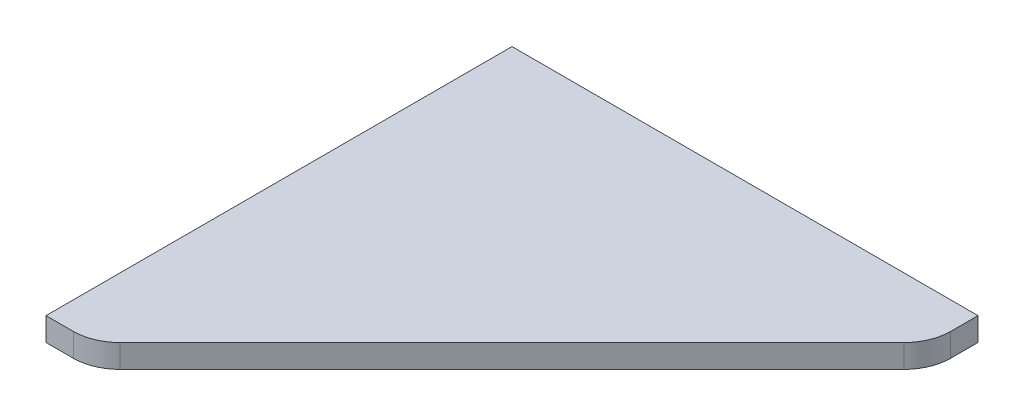
ISO-10303-21;
HEADER;
FILE_DESCRIPTION(('STEP AP214'),'2;1');
FILE_NAME('part.step','',(''),(''),'','','');
FILE_SCHEMA(('AUTOMOTIVE_DESIGN { 1 0 10303 214 1 1 1 1 }'));
ENDSEC;
DATA;
#1=APPLICATION_CONTEXT('core data for automotive mechanical design processes');
#2=APPLICATION_PROTOCOL_DEFINITION('international standard','automotive_design',2000,#1);
#3=PRODUCT_CONTEXT('',#1,'mechanical');
#4=PRODUCT('Part','Part','',(#3));
#5=PRODUCT_RELATED_PRODUCT_CATEGORY('part','',(#4));
#6=PRODUCT_DEFINITION_FORMATION('','',#4);
#7=PRODUCT_DEFINITION_CONTEXT('part definition',#1,'design');
#8=PRODUCT_DEFINITION('design','',#6,#7);
#9=PRODUCT_DEFINITION_SHAPE('','',#8);
#10=(LENGTH_UNIT() NAMED_UNIT(*) SI_UNIT(.MILLI.,.METRE.));
#11=(NAMED_UNIT(*) PLANE_ANGLE_UNIT() SI_UNIT($,.RADIAN.));
#12=(NAMED_UNIT(*) SI_UNIT($,.STERADIAN.) SOLID_ANGLE_UNIT());
#13=UNCERTAINTY_MEASURE_WITH_UNIT(LENGTH_MEASURE(1.E-05),#10,'distance_accuracy_value','');
#14=(GEOMETRIC_REPRESENTATION_CONTEXT(3) GLOBAL_UNCERTAINTY_ASSIGNED_CONTEXT((#13)) GLOBAL_UNIT_ASSIGNED_CONTEXT((#10,
#11,#12)) REPRESENTATION_CONTEXT('',''));
#15=CARTESIAN_POINT('',(0.,0.,0.));
#16=DIRECTION('',(0.,0.,1.));
#17=DIRECTION('',(1.,0.,0.));
#18=AXIS2_PLACEMENT_3D('',#15,#16,#17);
#19=CARTESIAN_POINT('',(0.,0.,0.));
#20=DIRECTION('',(0.,-1.,0.));
#21=DIRECTION('',(0.,0.,-1.));
#22=AXIS2_PLACEMENT_3D('',#19,#20,#21);
#23=PLANE('',#22);
#24=DIRECTION('',(-0.707106781186547,0.,0.707106781186548));
#25=VECTOR('',#24,1.);
#26=CARTESIAN_POINT('',(-32.2915814928118,0.,-32.2915814928118));
#27=LINE('',#26,#25);
#28=CARTESIAN_POINT('',(-134.823381605349,0.,70.2402186197255));
#29=VERTEX_POINT('',#28);
#30=CARTESIAN_POINT('',(-188.253637726418,0.,123.670474740795));
#31=VERTEX_POINT('',#30);
#32=EDGE_CURVE('E190',#29,#31,#27,.T.);
#33=ORIENTED_EDGE('',*,*,#32,.T.);
#34=CARTESIAN_POINT('',(-192.743765786953,0.,119.18034668026));
#35=DIRECTION('',(0.,1.,0.));
#36=DIRECTION('',(0.,0.,1.));
#37=AXIS2_PLACEMENT_3D('',#34,#35,#36);
#38=CIRCLE('',#37,6.34999999999999);
#39=CARTESIAN_POINT('',(-192.743765786953,0.,125.53034668026));
#40=VERTEX_POINT('',#39);
#41=EDGE_CURVE('E113',#40,#31,#38,.T.);
#42=ORIENTED_EDGE('',*,*,#41,.F.);
#43=DIRECTION('',(1.,0.,0.));
#44=VECTOR('',#43,1.);
#45=CARTESIAN_POINT('',(0.,0.,125.53034668026));
#46=LINE('',#45,#44);
#47=CARTESIAN_POINT('',(-196.463509665884,0.,125.53034668026));
#48=VERTEX_POINT('',#47);
#49=EDGE_CURVE('E175',#48,#40,#46,.T.);
#50=ORIENTED_EDGE('',*,*,#49,.F.);
#51=DIRECTION('',(0.,0.,1.));
#52=VECTOR('',#51,1.);
#53=CARTESIAN_POINT('',(-196.463509665884,0.,0.));
#54=LINE('',#53,#52);
#55=CARTESIAN_POINT('',(-196.463509665884,0.,62.0303466802601));
#56=VERTEX_POINT('',#55);
#57=EDGE_CURVE('E172',#56,#48,#54,.T.);
#58=ORIENTED_EDGE('',*,*,#57,.F.);
#59=DIRECTION('',(1.,0.,0.));
#60=VECTOR('',#59,1.);
#61=CARTESIAN_POINT('',(0.,0.,62.0303466802601));
#62=LINE('',#61,#60);
#63=CARTESIAN_POINT('',(-132.963509665884,0.,62.0303466802601));
#64=VERTEX_POINT('',#63);
#65=EDGE_CURVE('E192',#56,#64,#62,.T.);
#66=ORIENTED_EDGE('',*,*,#65,.T.);
#67=DIRECTION('',(0.,0.,1.));
#68=VECTOR('',#67,1.);
#69=CARTESIAN_POINT('',(-132.963509665883,0.,-9.92132487280706E-13));
#70=LINE('',#69,#68);
#71=CARTESIAN_POINT('',(-132.963509665884,0.,65.7500905591909));
#72=VERTEX_POINT('',#71);
#73=EDGE_CURVE('E195',#64,#72,#70,.T.);
#74=ORIENTED_EDGE('',*,*,#73,.T.);
#75=CARTESIAN_POINT('',(-139.313509665884,0.,65.7500905591909));
#76=DIRECTION('',(0.,1.,0.));
#77=DIRECTION('',(0.,0.,1.));
#78=AXIS2_PLACEMENT_3D('',#75,#76,#77);
#79=CIRCLE('',#78,6.34999999999997);
#80=EDGE_CURVE('E176',#72,#29,#79,.F.);
#81=ORIENTED_EDGE('',*,*,#80,.T.);
#82=EDGE_LOOP('',(#33,#42,#50,#58,#66,#74,#81));
#83=FACE_BOUND('',#82,.T.);
#84=ADVANCED_FACE('F94',(#83),#23,.T.);
#85=CARTESIAN_POINT('',(0.,0.,125.53034668026));
#86=DIRECTION('',(0.,0.,1.));
#87=DIRECTION('',(1.,0.,0.));
#88=AXIS2_PLACEMENT_3D('',#85,#86,#87);
#89=PLANE('',#88);
#90=DIRECTION('',(-1.,0.,0.));
#91=VECTOR('',#90,1.);
#92=CARTESIAN_POINT('',(0.,3.175,125.53034668026));
#93=LINE('',#92,#91);
#94=CARTESIAN_POINT('',(-192.743765786953,3.175,125.53034668026));
#95=VERTEX_POINT('',#94);
#96=CARTESIAN_POINT('',(-196.463509665884,3.175,125.53034668026));
#97=VERTEX_POINT('',#96);
#98=EDGE_CURVE('E165',#95,#97,#93,.T.);
#99=ORIENTED_EDGE('',*,*,#98,.T.);
#100=DIRECTION('',(0.,1.,0.));
#101=VECTOR('',#100,1.);
#102=CARTESIAN_POINT('',(-196.463509665884,0.,125.53034668026));
#103=LINE('',#102,#101);
#104=EDGE_CURVE('E182',#48,#97,#103,.T.);
#105=ORIENTED_EDGE('',*,*,#104,.F.);
#106=ORIENTED_EDGE('',*,*,#49,.T.);
#107=DIRECTION('',(0.,1.,0.));
#108=VECTOR('',#107,1.);
#109=CARTESIAN_POINT('',(-192.743765786953,0.,125.53034668026));
#110=LINE('',#109,#108);
#111=EDGE_CURVE('E173',#40,#95,#110,.T.);
#112=ORIENTED_EDGE('',*,*,#111,.T.);
#113=EDGE_LOOP('',(#99,#105,#106,#112));
#114=FACE_BOUND('',#113,.T.);
#115=ADVANCED_FACE('F207',(#114),#89,.T.);
#116=CARTESIAN_POINT('',(-196.463509665884,0.,0.));
#117=DIRECTION('',(-1.,0.,0.));
#118=DIRECTION('',(0.,0.,1.));
#119=AXIS2_PLACEMENT_3D('',#116,#117,#118);
#120=PLANE('',#119);
#121=DIRECTION('',(0.,0.,-1.));
#122=VECTOR('',#121,1.);
#123=CARTESIAN_POINT('',(-196.463509665884,3.175,0.));
#124=LINE('',#123,#122);
#125=CARTESIAN_POINT('',(-196.463509665884,3.175,62.0303466802601));
#126=VERTEX_POINT('',#125);
#127=EDGE_CURVE('E169',#97,#126,#124,.T.);
#128=ORIENTED_EDGE('',*,*,#127,.T.);
#129=DIRECTION('',(0.,1.,0.));
#130=VECTOR('',#129,1.);
#131=CARTESIAN_POINT('',(-196.463509665884,0.,62.0303466802601));
#132=LINE('',#131,#130);
#133=EDGE_CURVE('E185',#56,#126,#132,.T.);
#134=ORIENTED_EDGE('',*,*,#133,.F.);
#135=ORIENTED_EDGE('',*,*,#57,.T.);
#136=ORIENTED_EDGE('',*,*,#104,.T.);
#137=EDGE_LOOP('',(#128,#134,#135,#136));
#138=FACE_BOUND('',#137,.T.);
#139=ADVANCED_FACE('F222',(#138),#120,.T.);
#140=CARTESIAN_POINT('',(0.,0.,62.0303466802601));
#141=DIRECTION('',(0.,0.,1.));
#142=DIRECTION('',(1.,0.,0.));
#143=AXIS2_PLACEMENT_3D('',#140,#141,#142);
#144=PLANE('',#143);
#145=DIRECTION('',(0.,1.,0.));
#146=VECTOR('',#145,1.);
#147=CARTESIAN_POINT('',(-132.963509665884,0.,62.0303466802601));
#148=LINE('',#147,#146);
#149=CARTESIAN_POINT('',(-132.963509665884,3.175,62.0303466802601));
#150=VERTEX_POINT('',#149);
#151=EDGE_CURVE('E179',#64,#150,#148,.T.);
#152=ORIENTED_EDGE('',*,*,#151,.F.);
#153=ORIENTED_EDGE('',*,*,#65,.F.);
#154=ORIENTED_EDGE('',*,*,#133,.T.);
#155=DIRECTION('',(-1.,0.,0.));
#156=VECTOR('',#155,1.);
#157=CARTESIAN_POINT('',(0.,3.175,62.0303466802601));
#158=LINE('',#157,#156);
#159=EDGE_CURVE('E12',#150,#126,#158,.T.);
#160=ORIENTED_EDGE('',*,*,#159,.F.);
#161=EDGE_LOOP('',(#152,#153,#154,#160));
#162=FACE_BOUND('',#161,.T.);
#163=ADVANCED_FACE('F219',(#162),#144,.F.);
#164=CARTESIAN_POINT('',(-132.963509665883,0.,-9.92132487280706E-13));
#165=DIRECTION('',(-1.,0.,0.));
#166=DIRECTION('',(0.,0.,1.));
#167=AXIS2_PLACEMENT_3D('',#164,#165,#166);
#168=PLANE('',#167);
#169=DIRECTION('',(0.,1.,0.));
#170=VECTOR('',#169,1.);
#171=CARTESIAN_POINT('',(-132.963509665884,0.,65.7500905591909));
#172=LINE('',#171,#170);
#173=CARTESIAN_POINT('',(-132.963509665884,3.175,65.7500905591909));
#174=VERTEX_POINT('',#173);
#175=EDGE_CURVE('E177',#72,#174,#172,.T.);
#176=ORIENTED_EDGE('',*,*,#175,.F.);
#177=ORIENTED_EDGE('',*,*,#73,.F.);
#178=ORIENTED_EDGE('',*,*,#151,.T.);
#179=DIRECTION('',(0.,0.,-1.));
#180=VECTOR('',#179,1.);
#181=CARTESIAN_POINT('',(-132.963509665883,3.175,-9.92132487280706E-13));
#182=LINE('',#181,#180);
#183=EDGE_CURVE('E104',#174,#150,#182,.T.);
#184=ORIENTED_EDGE('',*,*,#183,.F.);
#185=EDGE_LOOP('',(#176,#177,#178,#184));
#186=FACE_BOUND('',#185,.T.);
#187=ADVANCED_FACE('F214',(#186),#168,.F.);
#188=CARTESIAN_POINT('',(-139.313509665884,0.,65.7500905591909));
#189=DIRECTION('',(0.,1.,0.));
#190=DIRECTION('',(0.,0.,1.));
#191=AXIS2_PLACEMENT_3D('',#188,#189,#190);
#192=CYLINDRICAL_SURFACE('',#191,6.34999999999997);
#193=DIRECTION('',(0.,1.,0.));
#194=VECTOR('',#193,1.);
#195=CARTESIAN_POINT('',(-134.823381605349,0.,70.2402186197255));
#196=LINE('',#195,#194);
#197=CARTESIAN_POINT('',(-134.823381605349,3.175,70.2402186197255));
#198=VERTEX_POINT('',#197);
#199=EDGE_CURVE('E156',#29,#198,#196,.T.);
#200=ORIENTED_EDGE('',*,*,#199,.F.);
#201=ORIENTED_EDGE('',*,*,#80,.F.);
#202=ORIENTED_EDGE('',*,*,#175,.T.);
#203=CARTESIAN_POINT('',(-139.313509665884,3.175,65.7500905591909));
#204=DIRECTION('',(0.,1.,0.));
#205=DIRECTION('',(0.,0.,1.));
#206=AXIS2_PLACEMENT_3D('',#203,#204,#205);
#207=CIRCLE('',#206,6.34999999999997);
#208=EDGE_CURVE('E146',#174,#198,#207,.F.);
#209=ORIENTED_EDGE('',*,*,#208,.T.);
#210=EDGE_LOOP('',(#200,#201,#202,#209));
#211=FACE_BOUND('',#210,.T.);
#212=ADVANCED_FACE('F212',(#211),#192,.T.);
#213=CARTESIAN_POINT('',(-32.2915814928118,0.,-32.2915814928118));
#214=DIRECTION('',(-0.707106781186548,0.,-0.707106781186547));
#215=DIRECTION('',(-0.707106781186547,0.,0.707106781186548));
#216=AXIS2_PLACEMENT_3D('',#213,#214,#215);
#217=PLANE('',#216);
#218=DIRECTION('',(0.,1.,0.));
#219=VECTOR('',#218,1.);
#220=CARTESIAN_POINT('',(-188.253637726418,0.,123.670474740795));
#221=LINE('',#220,#219);
#222=CARTESIAN_POINT('',(-188.253637726418,3.175,123.670474740795));
#223=VERTEX_POINT('',#222);
#224=EDGE_CURVE('E154',#31,#223,#221,.T.);
#225=ORIENTED_EDGE('',*,*,#224,.F.);
#226=ORIENTED_EDGE('',*,*,#32,.F.);
#227=ORIENTED_EDGE('',*,*,#199,.T.);
#228=DIRECTION('',(-0.707106781186547,0.,0.707106781186548));
#229=VECTOR('',#228,1.);
#230=CARTESIAN_POINT('',(-32.2915814928118,3.175,-32.2915814928118));
#231=LINE('',#230,#229);
#232=EDGE_CURVE('E151',#198,#223,#231,.T.);
#233=ORIENTED_EDGE('',*,*,#232,.T.);
#234=EDGE_LOOP('',(#225,#226,#227,#233));
#235=FACE_BOUND('',#234,.T.);
#236=ADVANCED_FACE('F152',(#235),#217,.F.);
#237=CARTESIAN_POINT('',(-192.743765786953,0.,119.18034668026));
#238=DIRECTION('',(0.,1.,0.));
#239=DIRECTION('',(0.,0.,1.));
#240=AXIS2_PLACEMENT_3D('',#237,#238,#239);
#241=CYLINDRICAL_SURFACE('',#240,6.34999999999999);
#242=CARTESIAN_POINT('',(-192.743765786953,3.175,119.18034668026));
#243=DIRECTION('',(0.,1.,0.));
#244=DIRECTION('',(0.,0.,1.));
#245=AXIS2_PLACEMENT_3D('',#242,#243,#244);
#246=CIRCLE('',#245,6.34999999999999);
#247=EDGE_CURVE('E98',#95,#223,#246,.T.);
#248=ORIENTED_EDGE('',*,*,#247,.F.);
#249=ORIENTED_EDGE('',*,*,#111,.F.);
#250=ORIENTED_EDGE('',*,*,#41,.T.);
#251=ORIENTED_EDGE('',*,*,#224,.T.);
#252=EDGE_LOOP('',(#248,#249,#250,#251));
#253=FACE_BOUND('',#252,.T.);
#254=ADVANCED_FACE('F159',(#253),#241,.T.);
#255=CARTESIAN_POINT('',(0.,3.175,0.));
#256=DIRECTION('',(0.,-1.,0.));
#257=DIRECTION('',(0.,0.,-1.));
#258=AXIS2_PLACEMENT_3D('',#255,#256,#257);
#259=PLANE('',#258);
#260=ORIENTED_EDGE('',*,*,#247,.T.);
#261=ORIENTED_EDGE('',*,*,#232,.F.);
#262=ORIENTED_EDGE('',*,*,#208,.F.);
#263=ORIENTED_EDGE('',*,*,#183,.T.);
#264=ORIENTED_EDGE('',*,*,#159,.T.);
#265=ORIENTED_EDGE('',*,*,#127,.F.);
#266=ORIENTED_EDGE('',*,*,#98,.F.);
#267=EDGE_LOOP('',(#260,#261,#262,#263,#264,#265,#266));
#268=FACE_BOUND('',#267,.T.);
#269=ADVANCED_FACE('F96',(#268),#259,.F.);
#270=CLOSED_SHELL('',(#84,#115,#139,#163,#187,#212,#236,#254,#269));
#271=MANIFOLD_SOLID_BREP('B2',#270);
#272=ADVANCED_BREP_SHAPE_REPRESENTATION('',(#18,#271),#14);
#273=SHAPE_DEFINITION_REPRESENTATION(#9,#272);
ENDSEC;
END-ISO-10303-21;
